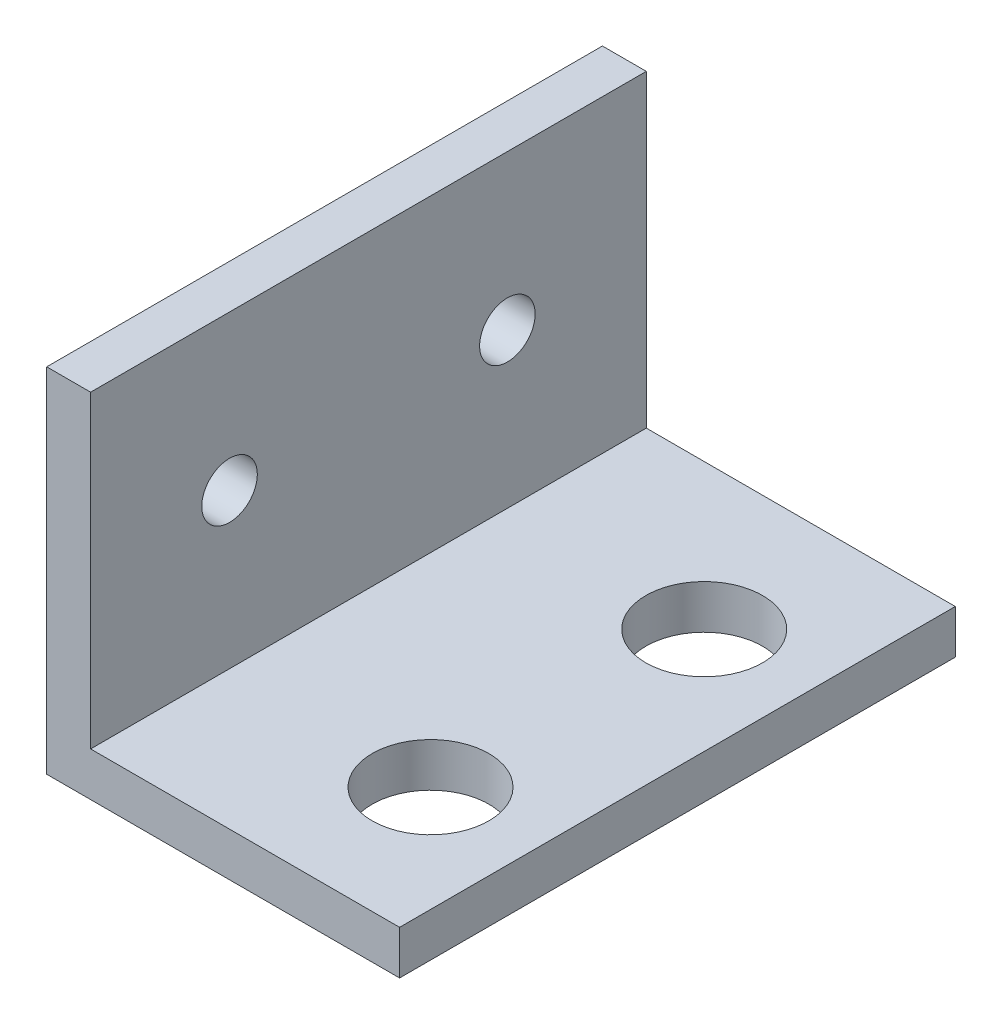
ISO-10303-21;
HEADER;
FILE_DESCRIPTION(('STEP AP214'),'2;1');
FILE_NAME('part.step','',(''),(''),'','','');
FILE_SCHEMA(('AUTOMOTIVE_DESIGN { 1 0 10303 214 1 1 1 1 }'));
ENDSEC;
DATA;
#1=APPLICATION_CONTEXT('core data for automotive mechanical design processes');
#2=APPLICATION_PROTOCOL_DEFINITION('international standard','automotive_design',2000,#1);
#3=PRODUCT_CONTEXT('',#1,'mechanical');
#4=PRODUCT('Part','Part','',(#3));
#5=PRODUCT_RELATED_PRODUCT_CATEGORY('part','',(#4));
#6=PRODUCT_DEFINITION_FORMATION('','',#4);
#7=PRODUCT_DEFINITION_CONTEXT('part definition',#1,'design');
#8=PRODUCT_DEFINITION('design','',#6,#7);
#9=PRODUCT_DEFINITION_SHAPE('','',#8);
#10=(LENGTH_UNIT() NAMED_UNIT(*) SI_UNIT(.MILLI.,.METRE.));
#11=(NAMED_UNIT(*) PLANE_ANGLE_UNIT() SI_UNIT($,.RADIAN.));
#12=(NAMED_UNIT(*) SI_UNIT($,.STERADIAN.) SOLID_ANGLE_UNIT());
#13=UNCERTAINTY_MEASURE_WITH_UNIT(LENGTH_MEASURE(1.E-05),#10,'distance_accuracy_value','');
#14=(GEOMETRIC_REPRESENTATION_CONTEXT(3) GLOBAL_UNCERTAINTY_ASSIGNED_CONTEXT((#13)) GLOBAL_UNIT_ASSIGNED_CONTEXT((#10,
#11,#12)) REPRESENTATION_CONTEXT('',''));
#15=CARTESIAN_POINT('',(0.,0.,0.));
#16=DIRECTION('',(0.,0.,1.));
#17=DIRECTION('',(1.,0.,0.));
#18=AXIS2_PLACEMENT_3D('',#15,#16,#17);
#19=CARTESIAN_POINT('',(0.,0.,-20.));
#20=DIRECTION('',(0.,1.,0.));
#21=DIRECTION('',(0.,0.,-1.));
#22=AXIS2_PLACEMENT_3D('',#19,#20,#21);
#23=PLANE('',#22);
#24=CARTESIAN_POINT('',(8.88885438200887,0.,-4.9250000000029));
#25=DIRECTION('',(0.,1.,0.));
#26=DIRECTION('',(0.,0.,1.));
#27=AXIS2_PLACEMENT_3D('',#24,#25,#26);
#28=CIRCLE('',#27,2.10000000000005);
#29=CARTESIAN_POINT('',(8.88885438200887,0.,-2.82500000000285));
#30=VERTEX_POINT('',#29);
#31=EDGE_CURVE('E163',#30,#30,#28,.T.);
#32=ORIENTED_EDGE('',*,*,#31,.T.);
#33=EDGE_LOOP('',(#32));
#34=FACE_BOUND('',#33,.T.);
#35=CARTESIAN_POINT('',(8.88885438200895,0.,-14.7750000000034));
#36=DIRECTION('',(0.,1.,0.));
#37=DIRECTION('',(0.,0.,1.));
#38=AXIS2_PLACEMENT_3D('',#35,#36,#37);
#39=CIRCLE('',#38,2.10000000000014);
#40=CARTESIAN_POINT('',(8.88885438200895,0.,-12.6750000000033));
#41=VERTEX_POINT('',#40);
#42=EDGE_CURVE('E164',#41,#41,#39,.T.);
#43=ORIENTED_EDGE('',*,*,#42,.T.);
#44=EDGE_LOOP('',(#43));
#45=FACE_BOUND('',#44,.T.);
#46=DIRECTION('',(1.,0.,0.));
#47=VECTOR('',#46,1.);
#48=CARTESIAN_POINT('',(0.,0.,0.));
#49=LINE('',#48,#47);
#50=CARTESIAN_POINT('',(0.,0.,0.));
#51=VERTEX_POINT('',#50);
#52=CARTESIAN_POINT('',(12.7,0.,0.));
#53=VERTEX_POINT('',#52);
#54=EDGE_CURVE('E120',#51,#53,#49,.T.);
#55=ORIENTED_EDGE('',*,*,#54,.F.);
#56=DIRECTION('',(0.,0.,1.));
#57=VECTOR('',#56,1.);
#58=CARTESIAN_POINT('',(0.,0.,-20.));
#59=LINE('',#58,#57);
#60=CARTESIAN_POINT('',(0.,0.,-20.));
#61=VERTEX_POINT('',#60);
#62=EDGE_CURVE('E119',#61,#51,#59,.T.);
#63=ORIENTED_EDGE('',*,*,#62,.F.);
#64=DIRECTION('',(1.,0.,0.));
#65=VECTOR('',#64,1.);
#66=CARTESIAN_POINT('',(0.,0.,-20.));
#67=LINE('',#66,#65);
#68=CARTESIAN_POINT('',(12.7,0.,-20.));
#69=VERTEX_POINT('',#68);
#70=EDGE_CURVE('E133',#61,#69,#67,.T.);
#71=ORIENTED_EDGE('',*,*,#70,.T.);
#72=DIRECTION('',(0.,0.,1.));
#73=VECTOR('',#72,1.);
#74=CARTESIAN_POINT('',(12.7,0.,-20.));
#75=LINE('',#74,#73);
#76=EDGE_CURVE('E11',#69,#53,#75,.T.);
#77=ORIENTED_EDGE('',*,*,#76,.T.);
#78=EDGE_LOOP('',(#55,#63,#71,#77));
#79=FACE_BOUND('',#78,.T.);
#80=ADVANCED_FACE('F37',(#34,#45,#79),#23,.F.);
#81=CARTESIAN_POINT('',(12.7,1.58,-20.));
#82=DIRECTION('',(-1.,0.,0.));
#83=DIRECTION('',(0.,0.,-1.));
#84=AXIS2_PLACEMENT_3D('',#81,#82,#83);
#85=PLANE('',#84);
#86=DIRECTION('',(0.,1.,0.));
#87=VECTOR('',#86,1.);
#88=CARTESIAN_POINT('',(12.7,1.58,0.));
#89=LINE('',#88,#87);
#90=CARTESIAN_POINT('',(12.7,1.58,0.));
#91=VERTEX_POINT('',#90);
#92=EDGE_CURVE('E122',#53,#91,#89,.T.);
#93=ORIENTED_EDGE('',*,*,#92,.F.);
#94=ORIENTED_EDGE('',*,*,#76,.F.);
#95=DIRECTION('',(0.,1.,0.));
#96=VECTOR('',#95,1.);
#97=CARTESIAN_POINT('',(12.7,1.58,-20.));
#98=LINE('',#97,#96);
#99=CARTESIAN_POINT('',(12.7,1.58,-20.));
#100=VERTEX_POINT('',#99);
#101=EDGE_CURVE('E85',#69,#100,#98,.T.);
#102=ORIENTED_EDGE('',*,*,#101,.T.);
#103=DIRECTION('',(0.,0.,1.));
#104=VECTOR('',#103,1.);
#105=CARTESIAN_POINT('',(12.7,1.58,-20.));
#106=LINE('',#105,#104);
#107=EDGE_CURVE('E45',#100,#91,#106,.T.);
#108=ORIENTED_EDGE('',*,*,#107,.T.);
#109=EDGE_LOOP('',(#93,#94,#102,#108));
#110=FACE_BOUND('',#109,.T.);
#111=ADVANCED_FACE('F139',(#110),#85,.F.);
#112=CARTESIAN_POINT('',(1.58,1.58,-20.));
#113=DIRECTION('',(0.,-1.,0.));
#114=DIRECTION('',(0.,0.,1.));
#115=AXIS2_PLACEMENT_3D('',#112,#113,#114);
#116=PLANE('',#115);
#117=CARTESIAN_POINT('',(8.88885438200887,1.58,-4.9250000000029));
#118=DIRECTION('',(0.,1.,0.));
#119=DIRECTION('',(0.,0.,1.));
#120=AXIS2_PLACEMENT_3D('',#117,#118,#119);
#121=CIRCLE('',#120,2.10000000000005);
#122=CARTESIAN_POINT('',(8.88885438200887,1.58,-2.82500000000285));
#123=VERTEX_POINT('',#122);
#124=EDGE_CURVE('E155',#123,#123,#121,.F.);
#125=ORIENTED_EDGE('',*,*,#124,.T.);
#126=EDGE_LOOP('',(#125));
#127=FACE_BOUND('',#126,.T.);
#128=CARTESIAN_POINT('',(8.88885438200895,1.58,-14.7750000000034));
#129=DIRECTION('',(0.,1.,0.));
#130=DIRECTION('',(0.,0.,1.));
#131=AXIS2_PLACEMENT_3D('',#128,#129,#130);
#132=CIRCLE('',#131,2.10000000000014);
#133=CARTESIAN_POINT('',(8.88885438200895,1.58,-12.6750000000033));
#134=VERTEX_POINT('',#133);
#135=EDGE_CURVE('E160',#134,#134,#132,.F.);
#136=ORIENTED_EDGE('',*,*,#135,.T.);
#137=EDGE_LOOP('',(#136));
#138=FACE_BOUND('',#137,.T.);
#139=DIRECTION('',(-1.,0.,0.));
#140=VECTOR('',#139,1.);
#141=CARTESIAN_POINT('',(1.58,1.58,0.));
#142=LINE('',#141,#140);
#143=CARTESIAN_POINT('',(1.58,1.58,0.));
#144=VERTEX_POINT('',#143);
#145=EDGE_CURVE('E126',#91,#144,#142,.T.);
#146=ORIENTED_EDGE('',*,*,#145,.F.);
#147=ORIENTED_EDGE('',*,*,#107,.F.);
#148=DIRECTION('',(-1.,0.,0.));
#149=VECTOR('',#148,1.);
#150=CARTESIAN_POINT('',(1.58,1.58,-20.));
#151=LINE('',#150,#149);
#152=CARTESIAN_POINT('',(1.58,1.58,-20.));
#153=VERTEX_POINT('',#152);
#154=EDGE_CURVE('E113',#100,#153,#151,.T.);
#155=ORIENTED_EDGE('',*,*,#154,.T.);
#156=DIRECTION('',(0.,0.,1.));
#157=VECTOR('',#156,1.);
#158=CARTESIAN_POINT('',(1.58,1.58,-20.));
#159=LINE('',#158,#157);
#160=EDGE_CURVE('E107',#153,#144,#159,.T.);
#161=ORIENTED_EDGE('',*,*,#160,.T.);
#162=EDGE_LOOP('',(#146,#147,#155,#161));
#163=FACE_BOUND('',#162,.T.);
#164=ADVANCED_FACE('F181',(#127,#138,#163),#116,.F.);
#165=CARTESIAN_POINT('',(1.58,1.58,-20.));
#166=DIRECTION('',(-1.,0.,0.));
#167=DIRECTION('',(0.,0.,-1.));
#168=AXIS2_PLACEMENT_3D('',#165,#166,#167);
#169=PLANE('',#168);
#170=CARTESIAN_POINT('',(1.58,7.14,-5.));
#171=DIRECTION('',(1.,0.,0.));
#172=DIRECTION('',(0.,0.,-1.));
#173=AXIS2_PLACEMENT_3D('',#170,#171,#172);
#174=CIRCLE('',#173,1.);
#175=CARTESIAN_POINT('',(1.58,7.14,-6.));
#176=VERTEX_POINT('',#175);
#177=EDGE_CURVE('E123',#176,#176,#174,.F.);
#178=ORIENTED_EDGE('',*,*,#177,.T.);
#179=EDGE_LOOP('',(#178));
#180=FACE_BOUND('',#179,.T.);
#181=CARTESIAN_POINT('',(1.58,7.14,-15.));
#182=DIRECTION('',(1.,0.,0.));
#183=DIRECTION('',(0.,0.,-1.));
#184=AXIS2_PLACEMENT_3D('',#181,#182,#183);
#185=CIRCLE('',#184,1.);
#186=CARTESIAN_POINT('',(1.58,7.14,-16.));
#187=VERTEX_POINT('',#186);
#188=EDGE_CURVE('E148',#187,#187,#185,.F.);
#189=ORIENTED_EDGE('',*,*,#188,.T.);
#190=EDGE_LOOP('',(#189));
#191=FACE_BOUND('',#190,.T.);
#192=DIRECTION('',(0.,1.,0.));
#193=VECTOR('',#192,1.);
#194=CARTESIAN_POINT('',(1.58,1.58,0.));
#195=LINE('',#194,#193);
#196=CARTESIAN_POINT('',(1.58,12.7,0.));
#197=VERTEX_POINT('',#196);
#198=EDGE_CURVE('E129',#144,#197,#195,.T.);
#199=ORIENTED_EDGE('',*,*,#198,.F.);
#200=ORIENTED_EDGE('',*,*,#160,.F.);
#201=DIRECTION('',(0.,1.,0.));
#202=VECTOR('',#201,1.);
#203=CARTESIAN_POINT('',(1.58,1.58,-20.));
#204=LINE('',#203,#202);
#205=CARTESIAN_POINT('',(1.58,12.7,-20.));
#206=VERTEX_POINT('',#205);
#207=EDGE_CURVE('E97',#153,#206,#204,.T.);
#208=ORIENTED_EDGE('',*,*,#207,.T.);
#209=DIRECTION('',(0.,0.,1.));
#210=VECTOR('',#209,1.);
#211=CARTESIAN_POINT('',(1.58,12.7,-20.));
#212=LINE('',#211,#210);
#213=EDGE_CURVE('E102',#206,#197,#212,.T.);
#214=ORIENTED_EDGE('',*,*,#213,.T.);
#215=EDGE_LOOP('',(#199,#200,#208,#214));
#216=FACE_BOUND('',#215,.T.);
#217=ADVANCED_FACE('F110',(#180,#191,#216),#169,.F.);
#218=CARTESIAN_POINT('',(0.,12.7,-20.));
#219=DIRECTION('',(0.,-1.,0.));
#220=DIRECTION('',(0.,0.,1.));
#221=AXIS2_PLACEMENT_3D('',#218,#219,#220);
#222=PLANE('',#221);
#223=DIRECTION('',(-1.,0.,0.));
#224=VECTOR('',#223,1.);
#225=CARTESIAN_POINT('',(0.,12.7,0.));
#226=LINE('',#225,#224);
#227=CARTESIAN_POINT('',(0.,12.7,0.));
#228=VERTEX_POINT('',#227);
#229=EDGE_CURVE('E104',#197,#228,#226,.T.);
#230=ORIENTED_EDGE('',*,*,#229,.F.);
#231=ORIENTED_EDGE('',*,*,#213,.F.);
#232=DIRECTION('',(-1.,0.,0.));
#233=VECTOR('',#232,1.);
#234=CARTESIAN_POINT('',(0.,12.7,-20.));
#235=LINE('',#234,#233);
#236=CARTESIAN_POINT('',(0.,12.7,-20.));
#237=VERTEX_POINT('',#236);
#238=EDGE_CURVE('E93',#206,#237,#235,.T.);
#239=ORIENTED_EDGE('',*,*,#238,.T.);
#240=DIRECTION('',(0.,0.,1.));
#241=VECTOR('',#240,1.);
#242=CARTESIAN_POINT('',(0.,12.7,-20.));
#243=LINE('',#242,#241);
#244=EDGE_CURVE('E108',#237,#228,#243,.T.);
#245=ORIENTED_EDGE('',*,*,#244,.T.);
#246=EDGE_LOOP('',(#230,#231,#239,#245));
#247=FACE_BOUND('',#246,.T.);
#248=ADVANCED_FACE('F103',(#247),#222,.F.);
#249=CARTESIAN_POINT('',(0.,0.,-20.));
#250=DIRECTION('',(1.,0.,0.));
#251=DIRECTION('',(0.,0.,1.));
#252=AXIS2_PLACEMENT_3D('',#249,#250,#251);
#253=PLANE('',#252);
#254=CARTESIAN_POINT('',(0.,7.14,-5.));
#255=DIRECTION('',(1.,0.,0.));
#256=DIRECTION('',(0.,0.,-1.));
#257=AXIS2_PLACEMENT_3D('',#254,#255,#256);
#258=CIRCLE('',#257,1.);
#259=CARTESIAN_POINT('',(0.,7.14,-6.));
#260=VERTEX_POINT('',#259);
#261=EDGE_CURVE('E151',#260,#260,#258,.T.);
#262=ORIENTED_EDGE('',*,*,#261,.T.);
#263=EDGE_LOOP('',(#262));
#264=FACE_BOUND('',#263,.T.);
#265=CARTESIAN_POINT('',(0.,7.14,-15.));
#266=DIRECTION('',(1.,0.,0.));
#267=DIRECTION('',(0.,0.,-1.));
#268=AXIS2_PLACEMENT_3D('',#265,#266,#267);
#269=CIRCLE('',#268,1.);
#270=CARTESIAN_POINT('',(0.,7.14,-16.));
#271=VERTEX_POINT('',#270);
#272=EDGE_CURVE('E152',#271,#271,#269,.T.);
#273=ORIENTED_EDGE('',*,*,#272,.T.);
#274=EDGE_LOOP('',(#273));
#275=FACE_BOUND('',#274,.T.);
#276=DIRECTION('',(0.,-1.,0.));
#277=VECTOR('',#276,1.);
#278=CARTESIAN_POINT('',(0.,0.,0.));
#279=LINE('',#278,#277);
#280=EDGE_CURVE('E73',#228,#51,#279,.T.);
#281=ORIENTED_EDGE('',*,*,#280,.F.);
#282=ORIENTED_EDGE('',*,*,#244,.F.);
#283=DIRECTION('',(0.,-1.,0.));
#284=VECTOR('',#283,1.);
#285=CARTESIAN_POINT('',(0.,0.,-20.));
#286=LINE('',#285,#284);
#287=EDGE_CURVE('E53',#237,#61,#286,.T.);
#288=ORIENTED_EDGE('',*,*,#287,.T.);
#289=ORIENTED_EDGE('',*,*,#62,.T.);
#290=EDGE_LOOP('',(#281,#282,#288,#289));
#291=FACE_BOUND('',#290,.T.);
#292=ADVANCED_FACE('F210',(#264,#275,#291),#253,.F.);
#293=CARTESIAN_POINT('',(0.,0.,-20.));
#294=DIRECTION('',(0.,0.,1.));
#295=DIRECTION('',(-1.,0.,0.));
#296=AXIS2_PLACEMENT_3D('',#293,#294,#295);
#297=PLANE('',#296);
#298=ORIENTED_EDGE('',*,*,#70,.F.);
#299=ORIENTED_EDGE('',*,*,#287,.F.);
#300=ORIENTED_EDGE('',*,*,#238,.F.);
#301=ORIENTED_EDGE('',*,*,#207,.F.);
#302=ORIENTED_EDGE('',*,*,#154,.F.);
#303=ORIENTED_EDGE('',*,*,#101,.F.);
#304=EDGE_LOOP('',(#298,#299,#300,#301,#302,#303));
#305=FACE_BOUND('',#304,.T.);
#306=ADVANCED_FACE('F95',(#305),#297,.F.);
#307=CARTESIAN_POINT('',(0.,0.,0.));
#308=DIRECTION('',(0.,0.,1.));
#309=DIRECTION('',(-1.,0.,0.));
#310=AXIS2_PLACEMENT_3D('',#307,#308,#309);
#311=PLANE('',#310);
#312=ORIENTED_EDGE('',*,*,#54,.T.);
#313=ORIENTED_EDGE('',*,*,#92,.T.);
#314=ORIENTED_EDGE('',*,*,#145,.T.);
#315=ORIENTED_EDGE('',*,*,#198,.T.);
#316=ORIENTED_EDGE('',*,*,#229,.T.);
#317=ORIENTED_EDGE('',*,*,#280,.T.);
#318=EDGE_LOOP('',(#312,#313,#314,#315,#316,#317));
#319=FACE_BOUND('',#318,.T.);
#320=ADVANCED_FACE('F141',(#319),#311,.T.);
#321=CARTESIAN_POINT('',(12.701,7.14,-15.));
#322=DIRECTION('',(-1.,0.,0.));
#323=DIRECTION('',(0.,0.,-1.));
#324=AXIS2_PLACEMENT_3D('',#321,#322,#323);
#325=CYLINDRICAL_SURFACE('',#324,1.);
#326=ORIENTED_EDGE('',*,*,#272,.F.);
#327=EDGE_LOOP('',(#326));
#328=FACE_BOUND('',#327,.T.);
#329=ORIENTED_EDGE('',*,*,#188,.F.);
#330=EDGE_LOOP('',(#329));
#331=FACE_BOUND('',#330,.T.);
#332=ADVANCED_FACE('F194',(#328,#331),#325,.F.);
#333=CARTESIAN_POINT('',(12.701,7.14,-5.));
#334=DIRECTION('',(-1.,0.,0.));
#335=DIRECTION('',(0.,0.,-1.));
#336=AXIS2_PLACEMENT_3D('',#333,#334,#335);
#337=CYLINDRICAL_SURFACE('',#336,1.);
#338=ORIENTED_EDGE('',*,*,#261,.F.);
#339=EDGE_LOOP('',(#338));
#340=FACE_BOUND('',#339,.T.);
#341=ORIENTED_EDGE('',*,*,#177,.F.);
#342=EDGE_LOOP('',(#341));
#343=FACE_BOUND('',#342,.T.);
#344=ADVANCED_FACE('F188',(#340,#343),#337,.F.);
#345=CARTESIAN_POINT('',(8.88885438200895,12.701,-14.7750000000034));
#346=DIRECTION('',(0.,-1.,0.));
#347=DIRECTION('',(0.,0.,1.));
#348=AXIS2_PLACEMENT_3D('',#345,#346,#347);
#349=CYLINDRICAL_SURFACE('',#348,2.10000000000014);
#350=ORIENTED_EDGE('',*,*,#42,.F.);
#351=EDGE_LOOP('',(#350));
#352=FACE_BOUND('',#351,.T.);
#353=ORIENTED_EDGE('',*,*,#135,.F.);
#354=EDGE_LOOP('',(#353));
#355=FACE_BOUND('',#354,.T.);
#356=ADVANCED_FACE('F177',(#352,#355),#349,.F.);
#357=CARTESIAN_POINT('',(8.88885438200887,12.701,-4.9250000000029));
#358=DIRECTION('',(0.,-1.,0.));
#359=DIRECTION('',(0.,0.,1.));
#360=AXIS2_PLACEMENT_3D('',#357,#358,#359);
#361=CYLINDRICAL_SURFACE('',#360,2.10000000000005);
#362=ORIENTED_EDGE('',*,*,#31,.F.);
#363=EDGE_LOOP('',(#362));
#364=FACE_BOUND('',#363,.T.);
#365=ORIENTED_EDGE('',*,*,#124,.F.);
#366=EDGE_LOOP('',(#365));
#367=FACE_BOUND('',#366,.T.);
#368=ADVANCED_FACE('F174',(#364,#367),#361,.F.);
#369=CLOSED_SHELL('',(#80,#111,#164,#217,#248,#292,#306,#320,#332,#344,#356,#368));
#370=MANIFOLD_SOLID_BREP('B2',#369);
#371=ADVANCED_BREP_SHAPE_REPRESENTATION('',(#18,#370),#14);
#372=SHAPE_DEFINITION_REPRESENTATION(#9,#371);
ENDSEC;
END-ISO-10303-21;
